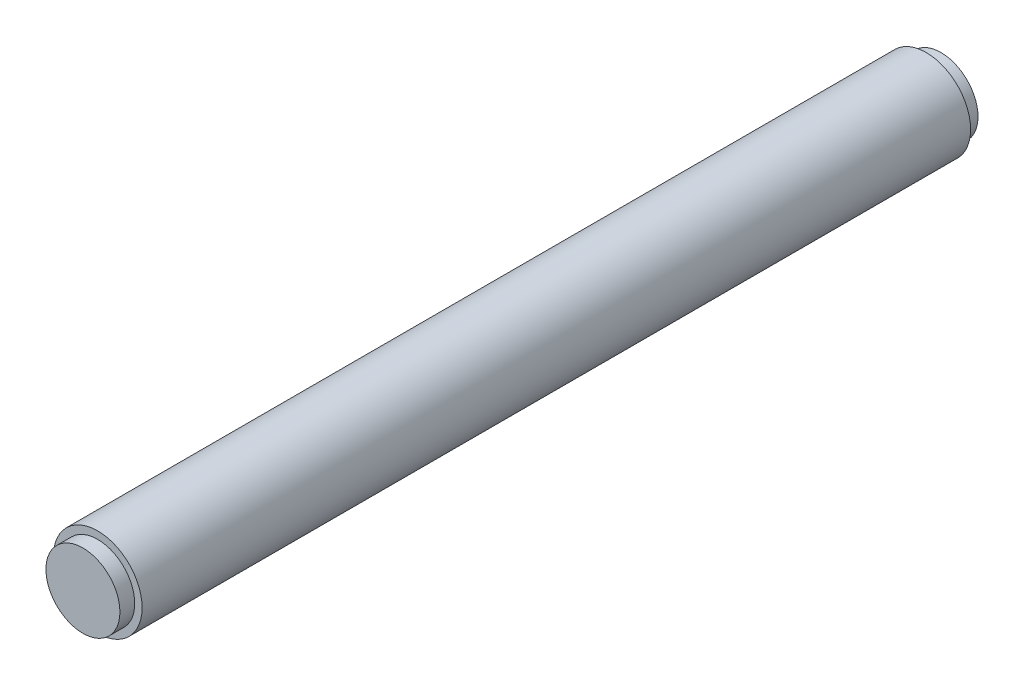
ISO-10303-21;
HEADER;
FILE_DESCRIPTION(('STEP AP214'),'2;1');
FILE_NAME('part.step','',(''),(''),'','','');
FILE_SCHEMA(('AUTOMOTIVE_DESIGN { 1 0 10303 214 1 1 1 1 }'));
ENDSEC;
DATA;
#1=APPLICATION_CONTEXT('core data for automotive mechanical design processes');
#2=APPLICATION_PROTOCOL_DEFINITION('international standard','automotive_design',2000,#1);
#3=PRODUCT_CONTEXT('',#1,'mechanical');
#4=PRODUCT('Part','Part','',(#3));
#5=PRODUCT_RELATED_PRODUCT_CATEGORY('part','',(#4));
#6=PRODUCT_DEFINITION_FORMATION('','',#4);
#7=PRODUCT_DEFINITION_CONTEXT('part definition',#1,'design');
#8=PRODUCT_DEFINITION('design','',#6,#7);
#9=PRODUCT_DEFINITION_SHAPE('','',#8);
#10=(LENGTH_UNIT() NAMED_UNIT(*) SI_UNIT(.MILLI.,.METRE.));
#11=(NAMED_UNIT(*) PLANE_ANGLE_UNIT() SI_UNIT($,.RADIAN.));
#12=(NAMED_UNIT(*) SI_UNIT($,.STERADIAN.) SOLID_ANGLE_UNIT());
#13=UNCERTAINTY_MEASURE_WITH_UNIT(LENGTH_MEASURE(1.E-05),#10,'distance_accuracy_value','');
#14=(GEOMETRIC_REPRESENTATION_CONTEXT(3) GLOBAL_UNCERTAINTY_ASSIGNED_CONTEXT((#13)) GLOBAL_UNIT_ASSIGNED_CONTEXT((#10,
#11,#12)) REPRESENTATION_CONTEXT('',''));
#15=CARTESIAN_POINT('',(0.,0.,0.));
#16=DIRECTION('',(0.,0.,1.));
#17=DIRECTION('',(1.,0.,0.));
#18=AXIS2_PLACEMENT_3D('',#15,#16,#17);
#19=CARTESIAN_POINT('',(-8.73725679509357,10.7454058192956,0.));
#20=DIRECTION('',(0.,0.,1.));
#21=DIRECTION('',(1.,0.,0.));
#22=AXIS2_PLACEMENT_3D('',#19,#20,#21);
#23=PLANE('',#22);
#24=CARTESIAN_POINT('',(-8.73725679509357,10.7454058192956,0.));
#25=DIRECTION('',(0.,0.,1.));
#26=DIRECTION('',(1.,0.,0.));
#27=AXIS2_PLACEMENT_3D('',#24,#25,#26);
#28=CIRCLE('',#27,30.);
#29=CARTESIAN_POINT('',(21.2627432049064,10.7454058192956,0.));
#30=VERTEX_POINT('',#29);
#31=EDGE_CURVE('E42',#30,#30,#28,.T.);
#32=ORIENTED_EDGE('',*,*,#31,.F.);
#33=EDGE_LOOP('',(#32));
#34=FACE_BOUND('',#33,.T.);
#35=CARTESIAN_POINT('',(-8.73725679509357,10.7454058192956,0.));
#36=DIRECTION('',(0.,0.,1.));
#37=DIRECTION('',(1.,0.,0.));
#38=AXIS2_PLACEMENT_3D('',#35,#36,#37);
#39=CIRCLE('',#38,25.);
#40=CARTESIAN_POINT('',(16.2627432049064,10.7454058192956,0.));
#41=VERTEX_POINT('',#40);
#42=EDGE_CURVE('E10',#41,#41,#39,.F.);
#43=ORIENTED_EDGE('',*,*,#42,.F.);
#44=EDGE_LOOP('',(#43));
#45=FACE_BOUND('',#44,.T.);
#46=ADVANCED_FACE('F31',(#34,#45),#23,.F.);
#47=CARTESIAN_POINT('',(-8.73725679509357,10.7454058192956,560.));
#48=DIRECTION('',(0.,0.,1.));
#49=DIRECTION('',(1.,0.,0.));
#50=AXIS2_PLACEMENT_3D('',#47,#48,#49);
#51=PLANE('',#50);
#52=CARTESIAN_POINT('',(-8.73725679509357,10.7454058192956,560.));
#53=DIRECTION('',(0.,0.,1.));
#54=DIRECTION('',(1.,0.,0.));
#55=AXIS2_PLACEMENT_3D('',#52,#53,#54);
#56=CIRCLE('',#55,30.);
#57=CARTESIAN_POINT('',(21.2627432049064,10.7454058192956,560.));
#58=VERTEX_POINT('',#57);
#59=EDGE_CURVE('E38',#58,#58,#56,.T.);
#60=ORIENTED_EDGE('',*,*,#59,.T.);
#61=EDGE_LOOP('',(#60));
#62=FACE_BOUND('',#61,.T.);
#63=CARTESIAN_POINT('',(-8.73725679509357,10.7454058192956,560.));
#64=DIRECTION('',(0.,0.,1.));
#65=DIRECTION('',(1.,0.,0.));
#66=AXIS2_PLACEMENT_3D('',#63,#64,#65);
#67=CIRCLE('',#66,25.);
#68=CARTESIAN_POINT('',(16.2627432049064,10.7454058192956,560.));
#69=VERTEX_POINT('',#68);
#70=EDGE_CURVE('E49',#69,#69,#67,.T.);
#71=ORIENTED_EDGE('',*,*,#70,.F.);
#72=EDGE_LOOP('',(#71));
#73=FACE_BOUND('',#72,.T.);
#74=ADVANCED_FACE('F73',(#62,#73),#51,.T.);
#75=CARTESIAN_POINT('',(-8.73725679509357,10.7454058192956,560.));
#76=DIRECTION('',(0.,0.,-1.));
#77=DIRECTION('',(-1.,0.,0.));
#78=AXIS2_PLACEMENT_3D('',#75,#76,#77);
#79=CYLINDRICAL_SURFACE('',#78,30.);
#80=ORIENTED_EDGE('',*,*,#59,.F.);
#81=EDGE_LOOP('',(#80));
#82=FACE_BOUND('',#81,.T.);
#83=ORIENTED_EDGE('',*,*,#31,.T.);
#84=EDGE_LOOP('',(#83));
#85=FACE_BOUND('',#84,.T.);
#86=ADVANCED_FACE('F33',(#82,#85),#79,.T.);
#87=CARTESIAN_POINT('',(-8.73725679509357,10.7454058192956,570.));
#88=DIRECTION('',(0.,0.,-1.));
#89=DIRECTION('',(-1.,0.,0.));
#90=AXIS2_PLACEMENT_3D('',#87,#88,#89);
#91=CYLINDRICAL_SURFACE('',#90,25.);
#92=CARTESIAN_POINT('',(-8.73725679509357,10.7454058192956,570.));
#93=DIRECTION('',(0.,0.,1.));
#94=DIRECTION('',(1.,0.,0.));
#95=AXIS2_PLACEMENT_3D('',#92,#93,#94);
#96=CIRCLE('',#95,25.);
#97=CARTESIAN_POINT('',(16.2627432049064,10.7454058192956,570.));
#98=VERTEX_POINT('',#97);
#99=EDGE_CURVE('E47',#98,#98,#96,.T.);
#100=ORIENTED_EDGE('',*,*,#99,.F.);
#101=EDGE_LOOP('',(#100));
#102=FACE_BOUND('',#101,.T.);
#103=ORIENTED_EDGE('',*,*,#70,.T.);
#104=EDGE_LOOP('',(#103));
#105=FACE_BOUND('',#104,.T.);
#106=ADVANCED_FACE('F69',(#102,#105),#91,.T.);
#107=CARTESIAN_POINT('',(-8.73725679509357,10.7454058192956,570.));
#108=DIRECTION('',(0.,0.,1.));
#109=DIRECTION('',(1.,0.,0.));
#110=AXIS2_PLACEMENT_3D('',#107,#108,#109);
#111=PLANE('',#110);
#112=ORIENTED_EDGE('',*,*,#99,.T.);
#113=EDGE_LOOP('',(#112));
#114=FACE_BOUND('',#113,.T.);
#115=ADVANCED_FACE('F62',(#114),#111,.T.);
#116=CARTESIAN_POINT('',(-8.73725679509357,10.7454058192956,-10.));
#117=DIRECTION('',(0.,0.,1.));
#118=DIRECTION('',(1.,0.,0.));
#119=AXIS2_PLACEMENT_3D('',#116,#117,#118);
#120=CYLINDRICAL_SURFACE('',#119,25.);
#121=CARTESIAN_POINT('',(-8.73725679509357,10.7454058192956,-10.));
#122=DIRECTION('',(0.,0.,-1.));
#123=DIRECTION('',(-1.,0.,0.));
#124=AXIS2_PLACEMENT_3D('',#121,#122,#123);
#125=CIRCLE('',#124,25.);
#126=CARTESIAN_POINT('',(-33.7372567950936,10.7454058192956,-10.));
#127=VERTEX_POINT('',#126);
#128=EDGE_CURVE('E52',#127,#127,#125,.T.);
#129=ORIENTED_EDGE('',*,*,#128,.F.);
#130=EDGE_LOOP('',(#129));
#131=FACE_BOUND('',#130,.T.);
#132=ORIENTED_EDGE('',*,*,#42,.T.);
#133=EDGE_LOOP('',(#132));
#134=FACE_BOUND('',#133,.T.);
#135=ADVANCED_FACE('F60',(#131,#134),#120,.T.);
#136=CARTESIAN_POINT('',(-8.73725679509357,10.7454058192956,-10.));
#137=DIRECTION('',(0.,0.,-1.));
#138=DIRECTION('',(-1.,0.,0.));
#139=AXIS2_PLACEMENT_3D('',#136,#137,#138);
#140=PLANE('',#139);
#141=ORIENTED_EDGE('',*,*,#128,.T.);
#142=EDGE_LOOP('',(#141));
#143=FACE_BOUND('',#142,.T.);
#144=ADVANCED_FACE('F58',(#143),#140,.T.);
#145=CLOSED_SHELL('',(#46,#74,#86,#106,#115,#135,#144));
#146=MANIFOLD_SOLID_BREP('B2',#145);
#147=ADVANCED_BREP_SHAPE_REPRESENTATION('',(#18,#146),#14);
#148=SHAPE_DEFINITION_REPRESENTATION(#9,#147);
ENDSEC;
END-ISO-10303-21;
